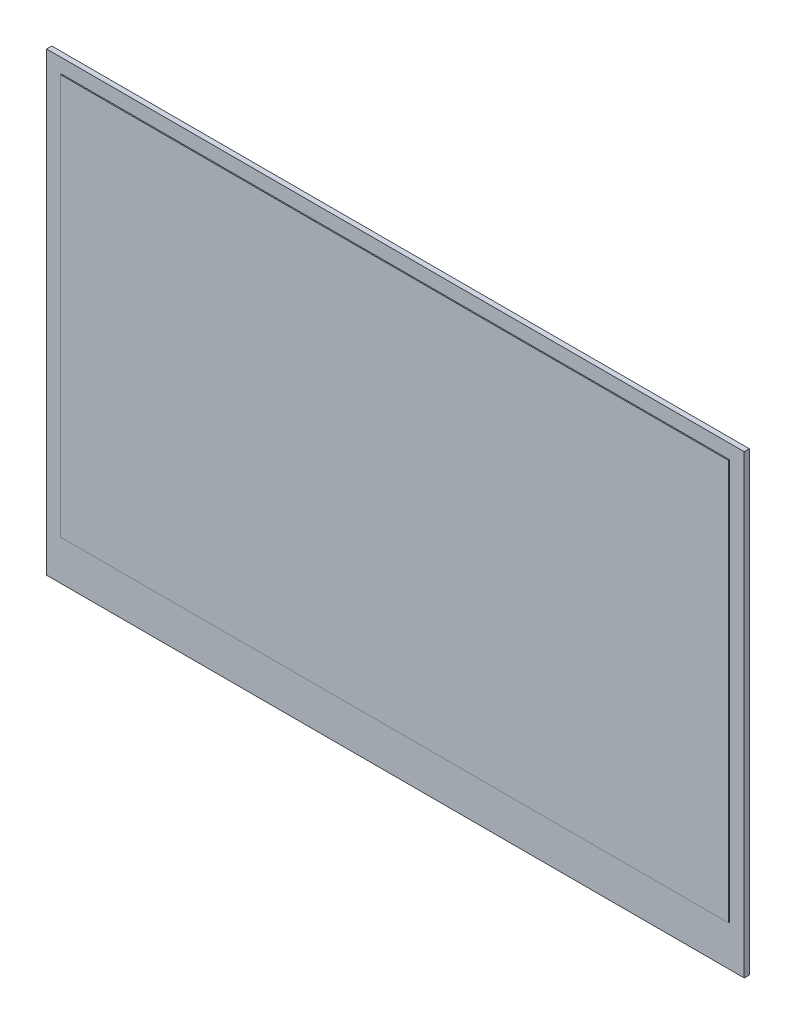
ISO-10303-21;
HEADER;
FILE_DESCRIPTION(('STEP AP214'),'2;1');
FILE_NAME('part.step','',(''),(''),'','','');
FILE_SCHEMA(('AUTOMOTIVE_DESIGN { 1 0 10303 214 1 1 1 1 }'));
ENDSEC;
DATA;
#1=APPLICATION_CONTEXT('core data for automotive mechanical design processes');
#2=APPLICATION_PROTOCOL_DEFINITION('international standard','automotive_design',2000,#1);
#3=PRODUCT_CONTEXT('',#1,'mechanical');
#4=PRODUCT('Part','Part','',(#3));
#5=PRODUCT_RELATED_PRODUCT_CATEGORY('part','',(#4));
#6=PRODUCT_DEFINITION_FORMATION('','',#4);
#7=PRODUCT_DEFINITION_CONTEXT('part definition',#1,'design');
#8=PRODUCT_DEFINITION('design','',#6,#7);
#9=PRODUCT_DEFINITION_SHAPE('','',#8);
#10=(LENGTH_UNIT() NAMED_UNIT(*) SI_UNIT(.MILLI.,.METRE.));
#11=(NAMED_UNIT(*) PLANE_ANGLE_UNIT() SI_UNIT($,.RADIAN.));
#12=(NAMED_UNIT(*) SI_UNIT($,.STERADIAN.) SOLID_ANGLE_UNIT());
#13=UNCERTAINTY_MEASURE_WITH_UNIT(LENGTH_MEASURE(1.E-05),#10,'distance_accuracy_value','');
#14=(GEOMETRIC_REPRESENTATION_CONTEXT(3) GLOBAL_UNCERTAINTY_ASSIGNED_CONTEXT((#13)) GLOBAL_UNIT_ASSIGNED_CONTEXT((#10,
#11,#12)) REPRESENTATION_CONTEXT('',''));
#15=CARTESIAN_POINT('',(0.,0.,0.));
#16=DIRECTION('',(0.,0.,1.));
#17=DIRECTION('',(1.,0.,0.));
#18=AXIS2_PLACEMENT_3D('',#15,#16,#17);
#19=CARTESIAN_POINT('',(85.1,55.6,1.25));
#20=DIRECTION('',(-1.,0.,0.));
#21=DIRECTION('',(0.,0.,1.));
#22=AXIS2_PLACEMENT_3D('',#19,#20,#21);
#23=PLANE('',#22);
#24=DIRECTION('',(0.,1.,0.));
#25=VECTOR('',#24,1.);
#26=CARTESIAN_POINT('',(85.1,55.6,0.));
#27=LINE('',#26,#25);
#28=CARTESIAN_POINT('',(85.1,-55.6,0.));
#29=VERTEX_POINT('',#28);
#30=CARTESIAN_POINT('',(85.1,55.6,0.));
#31=VERTEX_POINT('',#30);
#32=EDGE_CURVE('E122',#29,#31,#27,.T.);
#33=ORIENTED_EDGE('',*,*,#32,.T.);
#34=DIRECTION('',(0.,0.,-1.));
#35=VECTOR('',#34,1.);
#36=CARTESIAN_POINT('',(85.1,55.6,1.25));
#37=LINE('',#36,#35);
#38=CARTESIAN_POINT('',(85.1,55.6,1.25));
#39=VERTEX_POINT('',#38);
#40=EDGE_CURVE('E11',#39,#31,#37,.T.);
#41=ORIENTED_EDGE('',*,*,#40,.F.);
#42=DIRECTION('',(0.,1.,0.));
#43=VECTOR('',#42,1.);
#44=CARTESIAN_POINT('',(85.1,55.6,1.25));
#45=LINE('',#44,#43);
#46=CARTESIAN_POINT('',(85.1,-55.6,1.25));
#47=VERTEX_POINT('',#46);
#48=EDGE_CURVE('E131',#47,#39,#45,.T.);
#49=ORIENTED_EDGE('',*,*,#48,.F.);
#50=DIRECTION('',(0.,0.,-1.));
#51=VECTOR('',#50,1.);
#52=CARTESIAN_POINT('',(85.1,-55.6,1.25));
#53=LINE('',#52,#51);
#54=EDGE_CURVE('E140',#47,#29,#53,.T.);
#55=ORIENTED_EDGE('',*,*,#54,.T.);
#56=EDGE_LOOP('',(#33,#41,#49,#55));
#57=FACE_BOUND('',#56,.T.);
#58=ADVANCED_FACE('F38',(#57),#23,.F.);
#59=CARTESIAN_POINT('',(-85.1,55.6,1.25));
#60=DIRECTION('',(0.,-1.,0.));
#61=DIRECTION('',(0.,0.,-1.));
#62=AXIS2_PLACEMENT_3D('',#59,#60,#61);
#63=PLANE('',#62);
#64=DIRECTION('',(-1.,0.,0.));
#65=VECTOR('',#64,1.);
#66=CARTESIAN_POINT('',(-85.1,55.6,0.));
#67=LINE('',#66,#65);
#68=CARTESIAN_POINT('',(-85.1,55.6,0.));
#69=VERTEX_POINT('',#68);
#70=EDGE_CURVE('E125',#31,#69,#67,.T.);
#71=ORIENTED_EDGE('',*,*,#70,.T.);
#72=DIRECTION('',(0.,0.,-1.));
#73=VECTOR('',#72,1.);
#74=CARTESIAN_POINT('',(-85.1,55.6,1.25));
#75=LINE('',#74,#73);
#76=CARTESIAN_POINT('',(-85.1,55.6,1.25));
#77=VERTEX_POINT('',#76);
#78=EDGE_CURVE('E45',#77,#69,#75,.T.);
#79=ORIENTED_EDGE('',*,*,#78,.F.);
#80=DIRECTION('',(-1.,0.,0.));
#81=VECTOR('',#80,1.);
#82=CARTESIAN_POINT('',(-85.1,55.6,1.25));
#83=LINE('',#82,#81);
#84=EDGE_CURVE('E134',#39,#77,#83,.T.);
#85=ORIENTED_EDGE('',*,*,#84,.F.);
#86=ORIENTED_EDGE('',*,*,#40,.T.);
#87=EDGE_LOOP('',(#71,#79,#85,#86));
#88=FACE_BOUND('',#87,.T.);
#89=ADVANCED_FACE('F171',(#88),#63,.F.);
#90=CARTESIAN_POINT('',(-85.1,55.6,1.25));
#91=DIRECTION('',(1.,0.,0.));
#92=DIRECTION('',(0.,1.,0.));
#93=AXIS2_PLACEMENT_3D('',#90,#91,#92);
#94=PLANE('',#93);
#95=DIRECTION('',(0.,-1.,0.));
#96=VECTOR('',#95,1.);
#97=CARTESIAN_POINT('',(-85.1,55.6,0.));
#98=LINE('',#97,#96);
#99=CARTESIAN_POINT('',(-85.1,-55.6,0.));
#100=VERTEX_POINT('',#99);
#101=EDGE_CURVE('E143',#69,#100,#98,.T.);
#102=ORIENTED_EDGE('',*,*,#101,.T.);
#103=DIRECTION('',(0.,0.,-1.));
#104=VECTOR('',#103,1.);
#105=CARTESIAN_POINT('',(-85.1,-55.6,1.25));
#106=LINE('',#105,#104);
#107=CARTESIAN_POINT('',(-85.1,-55.6,1.25));
#108=VERTEX_POINT('',#107);
#109=EDGE_CURVE('E148',#108,#100,#106,.T.);
#110=ORIENTED_EDGE('',*,*,#109,.F.);
#111=DIRECTION('',(0.,-1.,0.));
#112=VECTOR('',#111,1.);
#113=CARTESIAN_POINT('',(-85.1,55.6,1.25));
#114=LINE('',#113,#112);
#115=EDGE_CURVE('E137',#77,#108,#114,.T.);
#116=ORIENTED_EDGE('',*,*,#115,.F.);
#117=ORIENTED_EDGE('',*,*,#78,.T.);
#118=EDGE_LOOP('',(#102,#110,#116,#117));
#119=FACE_BOUND('',#118,.T.);
#120=ADVANCED_FACE('F155',(#119),#94,.F.);
#121=CARTESIAN_POINT('',(-85.1,-55.6,1.25));
#122=DIRECTION('',(0.,1.,0.));
#123=DIRECTION('',(0.,0.,1.));
#124=AXIS2_PLACEMENT_3D('',#121,#122,#123);
#125=PLANE('',#124);
#126=DIRECTION('',(1.,0.,0.));
#127=VECTOR('',#126,1.);
#128=CARTESIAN_POINT('',(-85.1,-55.6,0.));
#129=LINE('',#128,#127);
#130=EDGE_CURVE('E135',#100,#29,#129,.T.);
#131=ORIENTED_EDGE('',*,*,#130,.T.);
#132=ORIENTED_EDGE('',*,*,#54,.F.);
#133=DIRECTION('',(1.,0.,0.));
#134=VECTOR('',#133,1.);
#135=CARTESIAN_POINT('',(-85.1,-55.6,1.25));
#136=LINE('',#135,#134);
#137=EDGE_CURVE('E139',#108,#47,#136,.T.);
#138=ORIENTED_EDGE('',*,*,#137,.F.);
#139=ORIENTED_EDGE('',*,*,#109,.T.);
#140=EDGE_LOOP('',(#131,#132,#138,#139));
#141=FACE_BOUND('',#140,.T.);
#142=ADVANCED_FACE('F164',(#141),#125,.F.);
#143=CARTESIAN_POINT('',(0.,0.,1.25));
#144=DIRECTION('',(0.,0.,1.));
#145=DIRECTION('',(1.,0.,0.));
#146=AXIS2_PLACEMENT_3D('',#143,#144,#145);
#147=PLANE('',#146);
#148=DIRECTION('',(0.,1.,0.));
#149=VECTOR('',#148,1.);
#150=CARTESIAN_POINT('',(81.5,52.11,1.25));
#151=LINE('',#150,#149);
#152=CARTESIAN_POINT('',(81.5,-45.61,1.25));
#153=VERTEX_POINT('',#152);
#154=CARTESIAN_POINT('',(81.5,52.11,1.25));
#155=VERTEX_POINT('',#154);
#156=EDGE_CURVE('E52',#153,#155,#151,.T.);
#157=ORIENTED_EDGE('',*,*,#156,.F.);
#158=DIRECTION('',(1.,0.,0.));
#159=VECTOR('',#158,1.);
#160=CARTESIAN_POINT('',(-81.5,-45.61,1.25));
#161=LINE('',#160,#159);
#162=CARTESIAN_POINT('',(-81.5,-45.61,1.25));
#163=VERTEX_POINT('',#162);
#164=EDGE_CURVE('E56',#163,#153,#161,.T.);
#165=ORIENTED_EDGE('',*,*,#164,.F.);
#166=DIRECTION('',(0.,-1.,0.));
#167=VECTOR('',#166,1.);
#168=CARTESIAN_POINT('',(-81.5,52.11,1.25));
#169=LINE('',#168,#167);
#170=CARTESIAN_POINT('',(-81.5,52.11,1.25));
#171=VERTEX_POINT('',#170);
#172=EDGE_CURVE('E267',#171,#163,#169,.T.);
#173=ORIENTED_EDGE('',*,*,#172,.F.);
#174=DIRECTION('',(-1.,0.,0.));
#175=VECTOR('',#174,1.);
#176=CARTESIAN_POINT('',(-81.5,52.11,1.25));
#177=LINE('',#176,#175);
#178=EDGE_CURVE('E273',#155,#171,#177,.T.);
#179=ORIENTED_EDGE('',*,*,#178,.F.);
#180=EDGE_LOOP('',(#157,#165,#173,#179));
#181=FACE_BOUND('',#180,.T.);
#182=ORIENTED_EDGE('',*,*,#48,.T.);
#183=ORIENTED_EDGE('',*,*,#84,.T.);
#184=ORIENTED_EDGE('',*,*,#115,.T.);
#185=ORIENTED_EDGE('',*,*,#137,.T.);
#186=EDGE_LOOP('',(#182,#183,#184,#185));
#187=FACE_BOUND('',#186,.T.);
#188=ADVANCED_FACE('F170',(#181,#187),#147,.T.);
#189=CARTESIAN_POINT('',(0.,0.,0.));
#190=DIRECTION('',(0.,0.,1.));
#191=DIRECTION('',(1.,0.,0.));
#192=AXIS2_PLACEMENT_3D('',#189,#190,#191);
#193=PLANE('',#192);
#194=ORIENTED_EDGE('',*,*,#32,.F.);
#195=ORIENTED_EDGE('',*,*,#130,.F.);
#196=ORIENTED_EDGE('',*,*,#101,.F.);
#197=ORIENTED_EDGE('',*,*,#70,.F.);
#198=EDGE_LOOP('',(#194,#195,#196,#197));
#199=FACE_BOUND('',#198,.T.);
#200=ADVANCED_FACE('F161',(#199),#193,.F.);
#201=CARTESIAN_POINT('',(81.5,52.11,1.5));
#202=DIRECTION('',(-1.,0.,0.));
#203=DIRECTION('',(0.,-1.,0.));
#204=AXIS2_PLACEMENT_3D('',#201,#202,#203);
#205=PLANE('',#204);
#206=ORIENTED_EDGE('',*,*,#156,.T.);
#207=DIRECTION('',(0.,0.,-1.));
#208=VECTOR('',#207,1.);
#209=CARTESIAN_POINT('',(81.5,52.11,1.5));
#210=LINE('',#209,#208);
#211=CARTESIAN_POINT('',(81.5,52.11,1.5));
#212=VERTEX_POINT('',#211);
#213=EDGE_CURVE('E105',#212,#155,#210,.T.);
#214=ORIENTED_EDGE('',*,*,#213,.F.);
#215=DIRECTION('',(0.,1.,0.));
#216=VECTOR('',#215,1.);
#217=CARTESIAN_POINT('',(81.5,52.11,1.5));
#218=LINE('',#217,#216);
#219=CARTESIAN_POINT('',(81.5,-45.61,1.5));
#220=VERTEX_POINT('',#219);
#221=EDGE_CURVE('E111',#220,#212,#218,.T.);
#222=ORIENTED_EDGE('',*,*,#221,.F.);
#223=DIRECTION('',(0.,0.,-1.));
#224=VECTOR('',#223,1.);
#225=CARTESIAN_POINT('',(81.5,-45.61,1.5));
#226=LINE('',#225,#224);
#227=EDGE_CURVE('E265',#220,#153,#226,.T.);
#228=ORIENTED_EDGE('',*,*,#227,.T.);
#229=EDGE_LOOP('',(#206,#214,#222,#228));
#230=FACE_BOUND('',#229,.T.);
#231=ADVANCED_FACE('F121',(#230),#205,.F.);
#232=CARTESIAN_POINT('',(-81.5,52.11,1.5));
#233=DIRECTION('',(0.,-1.,0.));
#234=DIRECTION('',(0.,0.,-1.));
#235=AXIS2_PLACEMENT_3D('',#232,#233,#234);
#236=PLANE('',#235);
#237=ORIENTED_EDGE('',*,*,#178,.T.);
#238=DIRECTION('',(0.,0.,-1.));
#239=VECTOR('',#238,1.);
#240=CARTESIAN_POINT('',(-81.5,52.11,1.5));
#241=LINE('',#240,#239);
#242=CARTESIAN_POINT('',(-81.5,52.11,1.5));
#243=VERTEX_POINT('',#242);
#244=EDGE_CURVE('E107',#243,#171,#241,.T.);
#245=ORIENTED_EDGE('',*,*,#244,.F.);
#246=DIRECTION('',(-1.,0.,0.));
#247=VECTOR('',#246,1.);
#248=CARTESIAN_POINT('',(-81.5,52.11,1.5));
#249=LINE('',#248,#247);
#250=EDGE_CURVE('E100',#212,#243,#249,.T.);
#251=ORIENTED_EDGE('',*,*,#250,.F.);
#252=ORIENTED_EDGE('',*,*,#213,.T.);
#253=EDGE_LOOP('',(#237,#245,#251,#252));
#254=FACE_BOUND('',#253,.T.);
#255=ADVANCED_FACE('F103',(#254),#236,.F.);
#256=CARTESIAN_POINT('',(-81.5,52.11,1.5));
#257=DIRECTION('',(1.,0.,0.));
#258=DIRECTION('',(0.,1.,0.));
#259=AXIS2_PLACEMENT_3D('',#256,#257,#258);
#260=PLANE('',#259);
#261=ORIENTED_EDGE('',*,*,#172,.T.);
#262=DIRECTION('',(0.,0.,-1.));
#263=VECTOR('',#262,1.);
#264=CARTESIAN_POINT('',(-81.5,-45.61,1.5));
#265=LINE('',#264,#263);
#266=CARTESIAN_POINT('',(-81.5,-45.61,1.5));
#267=VERTEX_POINT('',#266);
#268=EDGE_CURVE('E127',#267,#163,#265,.T.);
#269=ORIENTED_EDGE('',*,*,#268,.F.);
#270=DIRECTION('',(0.,-1.,0.));
#271=VECTOR('',#270,1.);
#272=CARTESIAN_POINT('',(-81.5,52.11,1.5));
#273=LINE('',#272,#271);
#274=EDGE_CURVE('E110',#243,#267,#273,.T.);
#275=ORIENTED_EDGE('',*,*,#274,.F.);
#276=ORIENTED_EDGE('',*,*,#244,.T.);
#277=EDGE_LOOP('',(#261,#269,#275,#276));
#278=FACE_BOUND('',#277,.T.);
#279=ADVANCED_FACE('F189',(#278),#260,.F.);
#280=CARTESIAN_POINT('',(-81.5,-45.61,1.5));
#281=DIRECTION('',(0.,1.,0.));
#282=DIRECTION('',(-1.,0.,0.));
#283=AXIS2_PLACEMENT_3D('',#280,#281,#282);
#284=PLANE('',#283);
#285=ORIENTED_EDGE('',*,*,#164,.T.);
#286=ORIENTED_EDGE('',*,*,#227,.F.);
#287=DIRECTION('',(1.,0.,0.));
#288=VECTOR('',#287,1.);
#289=CARTESIAN_POINT('',(-81.5,-45.61,1.5));
#290=LINE('',#289,#288);
#291=EDGE_CURVE('E116',#267,#220,#290,.T.);
#292=ORIENTED_EDGE('',*,*,#291,.F.);
#293=ORIENTED_EDGE('',*,*,#268,.T.);
#294=EDGE_LOOP('',(#285,#286,#292,#293));
#295=FACE_BOUND('',#294,.T.);
#296=ADVANCED_FACE('F192',(#295),#284,.F.);
#297=CARTESIAN_POINT('',(0.,0.,1.5));
#298=DIRECTION('',(0.,0.,1.));
#299=DIRECTION('',(1.,0.,0.));
#300=AXIS2_PLACEMENT_3D('',#297,#298,#299);
#301=PLANE('',#300);
#302=ORIENTED_EDGE('',*,*,#221,.T.);
#303=ORIENTED_EDGE('',*,*,#250,.T.);
#304=ORIENTED_EDGE('',*,*,#274,.T.);
#305=ORIENTED_EDGE('',*,*,#291,.T.);
#306=EDGE_LOOP('',(#302,#303,#304,#305));
#307=FACE_BOUND('',#306,.T.);
#308=ADVANCED_FACE('F114',(#307),#301,.T.);
#309=CLOSED_SHELL('',(#58,#89,#120,#142,#188,#200,#231,#255,#279,#296,#308));
#310=MANIFOLD_SOLID_BREP('B2',#309);
#311=ADVANCED_BREP_SHAPE_REPRESENTATION('',(#18,#310),#14);
#312=SHAPE_DEFINITION_REPRESENTATION(#9,#311);
ENDSEC;
END-ISO-10303-21;
